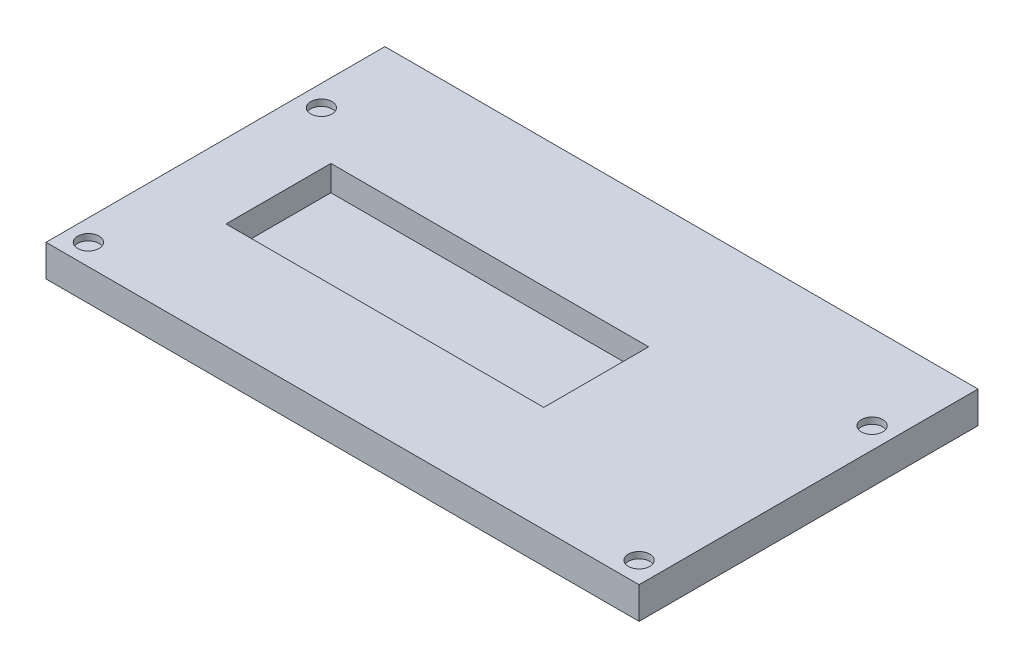
ISO-10303-21;
HEADER;
FILE_DESCRIPTION(('STEP AP214'),'2;1');
FILE_NAME('part.step','',(''),(''),'','','');
FILE_SCHEMA(('AUTOMOTIVE_DESIGN { 1 0 10303 214 1 1 1 1 }'));
ENDSEC;
DATA;
#1=APPLICATION_CONTEXT('core data for automotive mechanical design processes');
#2=APPLICATION_PROTOCOL_DEFINITION('international standard','automotive_design',2000,#1);
#3=PRODUCT_CONTEXT('',#1,'mechanical');
#4=PRODUCT('Part','Part','',(#3));
#5=PRODUCT_RELATED_PRODUCT_CATEGORY('part','',(#4));
#6=PRODUCT_DEFINITION_FORMATION('','',#4);
#7=PRODUCT_DEFINITION_CONTEXT('part definition',#1,'design');
#8=PRODUCT_DEFINITION('design','',#6,#7);
#9=PRODUCT_DEFINITION_SHAPE('','',#8);
#10=(LENGTH_UNIT() NAMED_UNIT(*) SI_UNIT(.MILLI.,.METRE.));
#11=(NAMED_UNIT(*) PLANE_ANGLE_UNIT() SI_UNIT($,.RADIAN.));
#12=(NAMED_UNIT(*) SI_UNIT($,.STERADIAN.) SOLID_ANGLE_UNIT());
#13=UNCERTAINTY_MEASURE_WITH_UNIT(LENGTH_MEASURE(1.E-05),#10,'distance_accuracy_value','');
#14=(GEOMETRIC_REPRESENTATION_CONTEXT(3) GLOBAL_UNCERTAINTY_ASSIGNED_CONTEXT((#13)) GLOBAL_UNIT_ASSIGNED_CONTEXT((#10,
#11,#12)) REPRESENTATION_CONTEXT('',''));
#15=CARTESIAN_POINT('',(0.,0.,0.));
#16=DIRECTION('',(0.,0.,1.));
#17=DIRECTION('',(1.,0.,0.));
#18=AXIS2_PLACEMENT_3D('',#15,#16,#17);
#19=CARTESIAN_POINT('',(155.,0.,80.));
#20=DIRECTION('',(0.,-1.,0.));
#21=DIRECTION('',(0.,0.,-1.));
#22=AXIS2_PLACEMENT_3D('',#19,#20,#21);
#23=PLANE('',#22);
#24=DIRECTION('',(0.,0.,-1.));
#25=VECTOR('',#24,1.);
#26=CARTESIAN_POINT('',(-542.916271204335,0.,212.102646828999));
#27=LINE('',#26,#25);
#28=CARTESIAN_POINT('',(-542.916271204335,0.,212.102646828999));
#29=VERTEX_POINT('',#28);
#30=CARTESIAN_POINT('',(-542.916271204335,0.,52.1026468289988));
#31=VERTEX_POINT('',#30);
#32=EDGE_CURVE('E94',#29,#31,#27,.T.);
#33=ORIENTED_EDGE('',*,*,#32,.F.);
#34=DIRECTION('',(-1.,0.,0.));
#35=VECTOR('',#34,1.);
#36=CARTESIAN_POINT('',(-542.916271204335,0.,212.102646828999));
#37=LINE('',#36,#35);
#38=CARTESIAN_POINT('',(-262.916271204335,0.,212.102646828999));
#39=VERTEX_POINT('',#38);
#40=EDGE_CURVE('E127',#39,#29,#37,.T.);
#41=ORIENTED_EDGE('',*,*,#40,.F.);
#42=DIRECTION('',(0.,0.,1.));
#43=VECTOR('',#42,1.);
#44=CARTESIAN_POINT('',(-262.916271204335,0.,212.102646828999));
#45=LINE('',#44,#43);
#46=CARTESIAN_POINT('',(-262.916271204335,0.,52.1026468289988));
#47=VERTEX_POINT('',#46);
#48=EDGE_CURVE('E119',#47,#39,#45,.T.);
#49=ORIENTED_EDGE('',*,*,#48,.F.);
#50=DIRECTION('',(1.,0.,0.));
#51=VECTOR('',#50,1.);
#52=CARTESIAN_POINT('',(-262.916271204335,0.,52.1026468289988));
#53=LINE('',#52,#51);
#54=EDGE_CURVE('E139',#31,#47,#53,.T.);
#55=ORIENTED_EDGE('',*,*,#54,.F.);
#56=EDGE_LOOP('',(#33,#41,#49,#55));
#57=FACE_BOUND('',#56,.T.);
#58=DIRECTION('',(0.,0.,-1.));
#59=VECTOR('',#58,1.);
#60=CARTESIAN_POINT('',(-507.916271204335,0.,162.102646828999));
#61=LINE('',#60,#59);
#62=CARTESIAN_POINT('',(-507.916271204335,0.,162.102646828999));
#63=VERTEX_POINT('',#62);
#64=CARTESIAN_POINT('',(-507.916271204335,0.,112.602646828999));
#65=VERTEX_POINT('',#64);
#66=EDGE_CURVE('E60',#63,#65,#61,.T.);
#67=ORIENTED_EDGE('',*,*,#66,.T.);
#68=DIRECTION('',(1.,0.,0.));
#69=VECTOR('',#68,1.);
#70=CARTESIAN_POINT('',(-507.916271204335,0.,112.602646828999));
#71=LINE('',#70,#69);
#72=CARTESIAN_POINT('',(-357.916271204335,0.,112.602646828999));
#73=VERTEX_POINT('',#72);
#74=EDGE_CURVE('E184',#65,#73,#71,.T.);
#75=ORIENTED_EDGE('',*,*,#74,.T.);
#76=DIRECTION('',(0.,0.,1.));
#77=VECTOR('',#76,1.);
#78=CARTESIAN_POINT('',(-357.916271204335,0.,162.102646828999));
#79=LINE('',#78,#77);
#80=CARTESIAN_POINT('',(-357.916271204335,0.,162.102646828999));
#81=VERTEX_POINT('',#80);
#82=EDGE_CURVE('E187',#73,#81,#79,.T.);
#83=ORIENTED_EDGE('',*,*,#82,.T.);
#84=DIRECTION('',(-1.,0.,0.));
#85=VECTOR('',#84,1.);
#86=CARTESIAN_POINT('',(-507.916271204335,0.,162.102646828999));
#87=LINE('',#86,#85);
#88=EDGE_CURVE('E190',#81,#63,#87,.T.);
#89=ORIENTED_EDGE('',*,*,#88,.T.);
#90=EDGE_LOOP('',(#67,#75,#83,#89));
#91=FACE_BOUND('',#90,.T.);
#92=CARTESIAN_POINT('',(-532.916271204335,0.,202.102646828999));
#93=DIRECTION('',(0.,-1.,0.));
#94=DIRECTION('',(0.,0.,-1.));
#95=AXIS2_PLACEMENT_3D('',#92,#93,#94);
#96=CIRCLE('',#95,5.05000000000007);
#97=CARTESIAN_POINT('',(-532.916271204335,0.,197.052646828999));
#98=VERTEX_POINT('',#97);
#99=EDGE_CURVE('E178',#98,#98,#96,.T.);
#100=ORIENTED_EDGE('',*,*,#99,.T.);
#101=EDGE_LOOP('',(#100));
#102=FACE_BOUND('',#101,.T.);
#103=CARTESIAN_POINT('',(-532.916271204335,0.,92.1026468289988));
#104=DIRECTION('',(0.,-1.,0.));
#105=DIRECTION('',(0.,0.,1.));
#106=AXIS2_PLACEMENT_3D('',#103,#104,#105);
#107=CIRCLE('',#106,5.05000000000007);
#108=CARTESIAN_POINT('',(-532.916271204335,0.,97.1526468289989));
#109=VERTEX_POINT('',#108);
#110=EDGE_CURVE('E173',#109,#109,#107,.T.);
#111=ORIENTED_EDGE('',*,*,#110,.T.);
#112=EDGE_LOOP('',(#111));
#113=FACE_BOUND('',#112,.T.);
#114=CARTESIAN_POINT('',(-272.916271204335,0.,92.1026468289988));
#115=DIRECTION('',(0.,-1.,0.));
#116=DIRECTION('',(0.,0.,-1.));
#117=AXIS2_PLACEMENT_3D('',#114,#115,#116);
#118=CIRCLE('',#117,5.04999999999996);
#119=CARTESIAN_POINT('',(-272.916271204335,0.,87.0526468289988));
#120=VERTEX_POINT('',#119);
#121=EDGE_CURVE('E166',#120,#120,#118,.T.);
#122=ORIENTED_EDGE('',*,*,#121,.T.);
#123=EDGE_LOOP('',(#122));
#124=FACE_BOUND('',#123,.T.);
#125=CARTESIAN_POINT('',(-272.916271204335,0.,202.102646828999));
#126=DIRECTION('',(0.,-1.,0.));
#127=DIRECTION('',(0.,0.,1.));
#128=AXIS2_PLACEMENT_3D('',#125,#126,#127);
#129=CIRCLE('',#128,5.04999999999996);
#130=CARTESIAN_POINT('',(-272.916271204335,0.,207.152646828999));
#131=VERTEX_POINT('',#130);
#132=EDGE_CURVE('E163',#131,#131,#129,.T.);
#133=ORIENTED_EDGE('',*,*,#132,.T.);
#134=EDGE_LOOP('',(#133));
#135=FACE_BOUND('',#134,.T.);
#136=ADVANCED_FACE('F41',(#57,#91,#102,#113,#124,#135),#23,.F.);
#137=CARTESIAN_POINT('',(-542.916271204335,-3.,212.102646828999));
#138=DIRECTION('',(1.,0.,0.));
#139=DIRECTION('',(0.,0.,-1.));
#140=AXIS2_PLACEMENT_3D('',#137,#138,#139);
#141=PLANE('',#140);
#142=ORIENTED_EDGE('',*,*,#32,.T.);
#143=DIRECTION('',(0.,1.,0.));
#144=VECTOR('',#143,1.);
#145=CARTESIAN_POINT('',(-542.916271204335,0.,52.1026468289988));
#146=LINE('',#145,#144);
#147=CARTESIAN_POINT('',(-542.916271204335,-15.,52.1026468289988));
#148=VERTEX_POINT('',#147);
#149=EDGE_CURVE('E142',#148,#31,#146,.T.);
#150=ORIENTED_EDGE('',*,*,#149,.F.);
#151=DIRECTION('',(0.,0.,-1.));
#152=VECTOR('',#151,1.);
#153=CARTESIAN_POINT('',(-542.916271204335,-15.,212.102646828999));
#154=LINE('',#153,#152);
#155=CARTESIAN_POINT('',(-542.916271204335,-15.,212.102646828999));
#156=VERTEX_POINT('',#155);
#157=EDGE_CURVE('E86',#156,#148,#154,.T.);
#158=ORIENTED_EDGE('',*,*,#157,.F.);
#159=DIRECTION('',(0.,1.,0.));
#160=VECTOR('',#159,1.);
#161=CARTESIAN_POINT('',(-542.916271204335,-3.,212.102646828999));
#162=LINE('',#161,#160);
#163=EDGE_CURVE('E51',#156,#29,#162,.T.);
#164=ORIENTED_EDGE('',*,*,#163,.T.);
#165=EDGE_LOOP('',(#142,#150,#158,#164));
#166=FACE_BOUND('',#165,.T.);
#167=ADVANCED_FACE('F225',(#166),#141,.F.);
#168=CARTESIAN_POINT('',(-262.916271204335,-3.,212.102646828999));
#169=DIRECTION('',(-1.,0.,0.));
#170=DIRECTION('',(0.,0.,1.));
#171=AXIS2_PLACEMENT_3D('',#168,#169,#170);
#172=PLANE('',#171);
#173=ORIENTED_EDGE('',*,*,#48,.T.);
#174=DIRECTION('',(0.,1.,0.));
#175=VECTOR('',#174,1.);
#176=CARTESIAN_POINT('',(-262.916271204335,-3.,212.102646828999));
#177=LINE('',#176,#175);
#178=CARTESIAN_POINT('',(-262.916271204335,-15.,212.102646828999));
#179=VERTEX_POINT('',#178);
#180=EDGE_CURVE('E11',#179,#39,#177,.T.);
#181=ORIENTED_EDGE('',*,*,#180,.F.);
#182=DIRECTION('',(0.,0.,1.));
#183=VECTOR('',#182,1.);
#184=CARTESIAN_POINT('',(-262.916271204335,-15.,212.102646828999));
#185=LINE('',#184,#183);
#186=CARTESIAN_POINT('',(-262.916271204335,-15.,52.1026468289988));
#187=VERTEX_POINT('',#186);
#188=EDGE_CURVE('E79',#187,#179,#185,.T.);
#189=ORIENTED_EDGE('',*,*,#188,.F.);
#190=DIRECTION('',(0.,-1.,0.));
#191=VECTOR('',#190,1.);
#192=CARTESIAN_POINT('',(-262.916271204335,0.,52.1026468289988));
#193=LINE('',#192,#191);
#194=EDGE_CURVE('E122',#47,#187,#193,.T.);
#195=ORIENTED_EDGE('',*,*,#194,.F.);
#196=EDGE_LOOP('',(#173,#181,#189,#195));
#197=FACE_BOUND('',#196,.T.);
#198=ADVANCED_FACE('F120',(#197),#172,.F.);
#199=CARTESIAN_POINT('',(-542.916271204335,-3.,212.102646828999));
#200=DIRECTION('',(0.,0.,-1.));
#201=DIRECTION('',(-1.,0.,0.));
#202=AXIS2_PLACEMENT_3D('',#199,#200,#201);
#203=PLANE('',#202);
#204=ORIENTED_EDGE('',*,*,#40,.T.);
#205=ORIENTED_EDGE('',*,*,#163,.F.);
#206=DIRECTION('',(-1.,0.,0.));
#207=VECTOR('',#206,1.);
#208=CARTESIAN_POINT('',(-542.916271204335,-15.,212.102646828999));
#209=LINE('',#208,#207);
#210=EDGE_CURVE('E132',#179,#156,#209,.T.);
#211=ORIENTED_EDGE('',*,*,#210,.F.);
#212=ORIENTED_EDGE('',*,*,#180,.T.);
#213=EDGE_LOOP('',(#204,#205,#211,#212));
#214=FACE_BOUND('',#213,.T.);
#215=ADVANCED_FACE('F131',(#214),#203,.F.);
#216=CARTESIAN_POINT('',(-507.916271204335,-3.,162.102646828999));
#217=DIRECTION('',(1.,0.,0.));
#218=DIRECTION('',(0.,0.,-1.));
#219=AXIS2_PLACEMENT_3D('',#216,#217,#218);
#220=PLANE('',#219);
#221=ORIENTED_EDGE('',*,*,#66,.F.);
#222=DIRECTION('',(0.,1.,0.));
#223=VECTOR('',#222,1.);
#224=CARTESIAN_POINT('',(-507.916271204335,-3.,162.102646828999));
#225=LINE('',#224,#223);
#226=CARTESIAN_POINT('',(-507.916271204335,-12.,162.102646828999));
#227=VERTEX_POINT('',#226);
#228=EDGE_CURVE('E193',#227,#63,#225,.T.);
#229=ORIENTED_EDGE('',*,*,#228,.F.);
#230=DIRECTION('',(0.,0.,-1.));
#231=VECTOR('',#230,1.);
#232=CARTESIAN_POINT('',(-507.916271204335,-12.,162.102646828999));
#233=LINE('',#232,#231);
#234=CARTESIAN_POINT('',(-507.916271204335,-12.,112.602646828999));
#235=VERTEX_POINT('',#234);
#236=EDGE_CURVE('E140',#227,#235,#233,.T.);
#237=ORIENTED_EDGE('',*,*,#236,.T.);
#238=DIRECTION('',(0.,1.,0.));
#239=VECTOR('',#238,1.);
#240=CARTESIAN_POINT('',(-507.916271204335,-3.,112.602646828999));
#241=LINE('',#240,#239);
#242=EDGE_CURVE('E199',#235,#65,#241,.T.);
#243=ORIENTED_EDGE('',*,*,#242,.T.);
#244=EDGE_LOOP('',(#221,#229,#237,#243));
#245=FACE_BOUND('',#244,.T.);
#246=ADVANCED_FACE('F201',(#245),#220,.T.);
#247=CARTESIAN_POINT('',(-507.916271204335,-3.,112.602646828999));
#248=DIRECTION('',(0.,0.,1.));
#249=DIRECTION('',(1.,0.,0.));
#250=AXIS2_PLACEMENT_3D('',#247,#248,#249);
#251=PLANE('',#250);
#252=ORIENTED_EDGE('',*,*,#74,.F.);
#253=ORIENTED_EDGE('',*,*,#242,.F.);
#254=DIRECTION('',(1.,0.,0.));
#255=VECTOR('',#254,1.);
#256=CARTESIAN_POINT('',(-507.916271204335,-12.,112.602646828999));
#257=LINE('',#256,#255);
#258=CARTESIAN_POINT('',(-357.916271204335,-12.,112.602646828999));
#259=VERTEX_POINT('',#258);
#260=EDGE_CURVE('E150',#235,#259,#257,.T.);
#261=ORIENTED_EDGE('',*,*,#260,.T.);
#262=DIRECTION('',(0.,1.,0.));
#263=VECTOR('',#262,1.);
#264=CARTESIAN_POINT('',(-357.916271204335,-3.,112.602646828999));
#265=LINE('',#264,#263);
#266=EDGE_CURVE('E197',#259,#73,#265,.T.);
#267=ORIENTED_EDGE('',*,*,#266,.T.);
#268=EDGE_LOOP('',(#252,#253,#261,#267));
#269=FACE_BOUND('',#268,.T.);
#270=ADVANCED_FACE('F212',(#269),#251,.T.);
#271=CARTESIAN_POINT('',(-357.916271204335,-3.,162.102646828999));
#272=DIRECTION('',(-1.,0.,0.));
#273=DIRECTION('',(0.,0.,1.));
#274=AXIS2_PLACEMENT_3D('',#271,#272,#273);
#275=PLANE('',#274);
#276=ORIENTED_EDGE('',*,*,#82,.F.);
#277=ORIENTED_EDGE('',*,*,#266,.F.);
#278=DIRECTION('',(0.,0.,1.));
#279=VECTOR('',#278,1.);
#280=CARTESIAN_POINT('',(-357.916271204335,-12.,162.102646828999));
#281=LINE('',#280,#279);
#282=CARTESIAN_POINT('',(-357.916271204335,-12.,162.102646828999));
#283=VERTEX_POINT('',#282);
#284=EDGE_CURVE('E153',#259,#283,#281,.T.);
#285=ORIENTED_EDGE('',*,*,#284,.T.);
#286=DIRECTION('',(0.,1.,0.));
#287=VECTOR('',#286,1.);
#288=CARTESIAN_POINT('',(-357.916271204335,-3.,162.102646828999));
#289=LINE('',#288,#287);
#290=EDGE_CURVE('E195',#283,#81,#289,.T.);
#291=ORIENTED_EDGE('',*,*,#290,.T.);
#292=EDGE_LOOP('',(#276,#277,#285,#291));
#293=FACE_BOUND('',#292,.T.);
#294=ADVANCED_FACE('F214',(#293),#275,.T.);
#295=CARTESIAN_POINT('',(-507.916271204335,-3.,162.102646828999));
#296=DIRECTION('',(0.,0.,-1.));
#297=DIRECTION('',(-1.,0.,0.));
#298=AXIS2_PLACEMENT_3D('',#295,#296,#297);
#299=PLANE('',#298);
#300=ORIENTED_EDGE('',*,*,#88,.F.);
#301=ORIENTED_EDGE('',*,*,#290,.F.);
#302=DIRECTION('',(-1.,0.,0.));
#303=VECTOR('',#302,1.);
#304=CARTESIAN_POINT('',(-507.916271204335,-12.,162.102646828999));
#305=LINE('',#304,#303);
#306=EDGE_CURVE('E156',#283,#227,#305,.T.);
#307=ORIENTED_EDGE('',*,*,#306,.T.);
#308=ORIENTED_EDGE('',*,*,#228,.T.);
#309=EDGE_LOOP('',(#300,#301,#307,#308));
#310=FACE_BOUND('',#309,.T.);
#311=ADVANCED_FACE('F208',(#310),#299,.T.);
#312=CARTESIAN_POINT('',(-532.916271204335,-3.,202.102646828999));
#313=DIRECTION('',(0.,1.,0.));
#314=DIRECTION('',(0.,0.,1.));
#315=AXIS2_PLACEMENT_3D('',#312,#313,#314);
#316=CYLINDRICAL_SURFACE('',#315,5.05000000000007);
#317=CARTESIAN_POINT('',(-532.916271204335,-3.,202.102646828999));
#318=DIRECTION('',(0.,-1.,0.));
#319=DIRECTION('',(0.,0.,-1.));
#320=AXIS2_PLACEMENT_3D('',#317,#318,#319);
#321=CIRCLE('',#320,5.05000000000007);
#322=CARTESIAN_POINT('',(-532.916271204335,-3.,197.052646828999));
#323=VERTEX_POINT('',#322);
#324=EDGE_CURVE('E170',#323,#323,#321,.T.);
#325=ORIENTED_EDGE('',*,*,#324,.T.);
#326=EDGE_LOOP('',(#325));
#327=FACE_BOUND('',#326,.T.);
#328=ORIENTED_EDGE('',*,*,#99,.F.);
#329=EDGE_LOOP('',(#328));
#330=FACE_BOUND('',#329,.T.);
#331=ADVANCED_FACE('F221',(#327,#330),#316,.F.);
#332=CARTESIAN_POINT('',(-532.916271204335,-3.,92.1026468289988));
#333=DIRECTION('',(0.,1.,0.));
#334=DIRECTION('',(0.,0.,1.));
#335=AXIS2_PLACEMENT_3D('',#332,#333,#334);
#336=CYLINDRICAL_SURFACE('',#335,5.05000000000007);
#337=CARTESIAN_POINT('',(-532.916271204335,-3.,92.1026468289988));
#338=DIRECTION('',(0.,-1.,0.));
#339=DIRECTION('',(0.,0.,1.));
#340=AXIS2_PLACEMENT_3D('',#337,#338,#339);
#341=CIRCLE('',#340,5.05000000000007);
#342=CARTESIAN_POINT('',(-532.916271204335,-3.,97.1526468289989));
#343=VERTEX_POINT('',#342);
#344=EDGE_CURVE('E162',#343,#343,#341,.T.);
#345=ORIENTED_EDGE('',*,*,#344,.T.);
#346=EDGE_LOOP('',(#345));
#347=FACE_BOUND('',#346,.T.);
#348=ORIENTED_EDGE('',*,*,#110,.F.);
#349=EDGE_LOOP('',(#348));
#350=FACE_BOUND('',#349,.T.);
#351=ADVANCED_FACE('F284',(#347,#350),#336,.F.);
#352=CARTESIAN_POINT('',(-272.916271204335,-3.,92.1026468289988));
#353=DIRECTION('',(0.,1.,0.));
#354=DIRECTION('',(0.,0.,1.));
#355=AXIS2_PLACEMENT_3D('',#352,#353,#354);
#356=CYLINDRICAL_SURFACE('',#355,5.04999999999996);
#357=CARTESIAN_POINT('',(-272.916271204335,-3.,92.1026468289988));
#358=DIRECTION('',(0.,-1.,0.));
#359=DIRECTION('',(0.,0.,-1.));
#360=AXIS2_PLACEMENT_3D('',#357,#358,#359);
#361=CIRCLE('',#360,5.04999999999996);
#362=CARTESIAN_POINT('',(-272.916271204335,-3.,87.0526468289988));
#363=VERTEX_POINT('',#362);
#364=EDGE_CURVE('E167',#363,#363,#361,.T.);
#365=ORIENTED_EDGE('',*,*,#364,.T.);
#366=EDGE_LOOP('',(#365));
#367=FACE_BOUND('',#366,.T.);
#368=ORIENTED_EDGE('',*,*,#121,.F.);
#369=EDGE_LOOP('',(#368));
#370=FACE_BOUND('',#369,.T.);
#371=ADVANCED_FACE('F294',(#367,#370),#356,.F.);
#372=CARTESIAN_POINT('',(-272.916271204335,-3.,202.102646828999));
#373=DIRECTION('',(0.,1.,0.));
#374=DIRECTION('',(0.,0.,1.));
#375=AXIS2_PLACEMENT_3D('',#372,#373,#374);
#376=CYLINDRICAL_SURFACE('',#375,5.04999999999996);
#377=CARTESIAN_POINT('',(-272.916271204335,-3.,202.102646828999));
#378=DIRECTION('',(0.,-1.,0.));
#379=DIRECTION('',(0.,0.,1.));
#380=AXIS2_PLACEMENT_3D('',#377,#378,#379);
#381=CIRCLE('',#380,5.04999999999996);
#382=CARTESIAN_POINT('',(-272.916271204335,-3.,207.152646828999));
#383=VERTEX_POINT('',#382);
#384=EDGE_CURVE('E159',#383,#383,#381,.T.);
#385=ORIENTED_EDGE('',*,*,#384,.T.);
#386=EDGE_LOOP('',(#385));
#387=FACE_BOUND('',#386,.T.);
#388=ORIENTED_EDGE('',*,*,#132,.F.);
#389=EDGE_LOOP('',(#388));
#390=FACE_BOUND('',#389,.T.);
#391=ADVANCED_FACE('F304',(#387,#390),#376,.F.);
#392=CARTESIAN_POINT('',(155.,-3.,80.));
#393=DIRECTION('',(0.,-1.,0.));
#394=DIRECTION('',(0.,0.,-1.));
#395=AXIS2_PLACEMENT_3D('',#392,#393,#394);
#396=PLANE('',#395);
#397=ORIENTED_EDGE('',*,*,#384,.F.);
#398=EDGE_LOOP('',(#397));
#399=FACE_BOUND('',#398,.T.);
#400=ADVANCED_FACE('F314',(#399),#396,.F.);
#401=ORIENTED_EDGE('',*,*,#344,.F.);
#402=EDGE_LOOP('',(#401));
#403=FACE_BOUND('',#402,.T.);
#404=ADVANCED_FACE('F324',(#403),#396,.F.);
#405=ORIENTED_EDGE('',*,*,#324,.F.);
#406=EDGE_LOOP('',(#405));
#407=FACE_BOUND('',#406,.T.);
#408=ADVANCED_FACE('F335',(#407),#396,.F.);
#409=ORIENTED_EDGE('',*,*,#364,.F.);
#410=EDGE_LOOP('',(#409));
#411=FACE_BOUND('',#410,.T.);
#412=ADVANCED_FACE('F327',(#411),#396,.F.);
#413=CARTESIAN_POINT('',(155.,-12.,80.));
#414=DIRECTION('',(0.,-1.,0.));
#415=DIRECTION('',(0.,0.,-1.));
#416=AXIS2_PLACEMENT_3D('',#413,#414,#415);
#417=PLANE('',#416);
#418=ORIENTED_EDGE('',*,*,#260,.F.);
#419=ORIENTED_EDGE('',*,*,#236,.F.);
#420=ORIENTED_EDGE('',*,*,#306,.F.);
#421=ORIENTED_EDGE('',*,*,#284,.F.);
#422=EDGE_LOOP('',(#418,#419,#420,#421));
#423=FACE_BOUND('',#422,.T.);
#424=ADVANCED_FACE('F210',(#423),#417,.F.);
#425=CARTESIAN_POINT('',(155.,-15.,80.));
#426=DIRECTION('',(0.,-1.,0.));
#427=DIRECTION('',(0.,0.,-1.));
#428=AXIS2_PLACEMENT_3D('',#425,#426,#427);
#429=PLANE('',#428);
#430=ORIENTED_EDGE('',*,*,#157,.T.);
#431=DIRECTION('',(-1.,0.,0.));
#432=VECTOR('',#431,1.);
#433=CARTESIAN_POINT('',(-262.916271204335,-15.,52.1026468289988));
#434=LINE('',#433,#432);
#435=EDGE_CURVE('E45',#187,#148,#434,.T.);
#436=ORIENTED_EDGE('',*,*,#435,.F.);
#437=ORIENTED_EDGE('',*,*,#188,.T.);
#438=ORIENTED_EDGE('',*,*,#210,.T.);
#439=EDGE_LOOP('',(#430,#436,#437,#438));
#440=FACE_BOUND('',#439,.T.);
#441=ADVANCED_FACE('F43',(#440),#429,.T.);
#442=CARTESIAN_POINT('',(155.,41.,52.1026468289988));
#443=DIRECTION('',(0.,0.,-1.));
#444=DIRECTION('',(-1.,0.,0.));
#445=AXIS2_PLACEMENT_3D('',#442,#443,#444);
#446=PLANE('',#445);
#447=ORIENTED_EDGE('',*,*,#194,.T.);
#448=ORIENTED_EDGE('',*,*,#435,.T.);
#449=ORIENTED_EDGE('',*,*,#149,.T.);
#450=ORIENTED_EDGE('',*,*,#54,.T.);
#451=EDGE_LOOP('',(#447,#448,#449,#450));
#452=FACE_BOUND('',#451,.T.);
#453=ADVANCED_FACE('F143',(#452),#446,.T.);
#454=CLOSED_SHELL('',(#136,#167,#198,#215,#246,#270,#294,#311,#331,#351,#371,#391,#400,#404,
#408,#412,#424,#441,#453));
#455=MANIFOLD_SOLID_BREP('B2',#454);
#456=ADVANCED_BREP_SHAPE_REPRESENTATION('',(#18,#455),#14);
#457=SHAPE_DEFINITION_REPRESENTATION(#9,#456);
ENDSEC;
END-ISO-10303-21;
